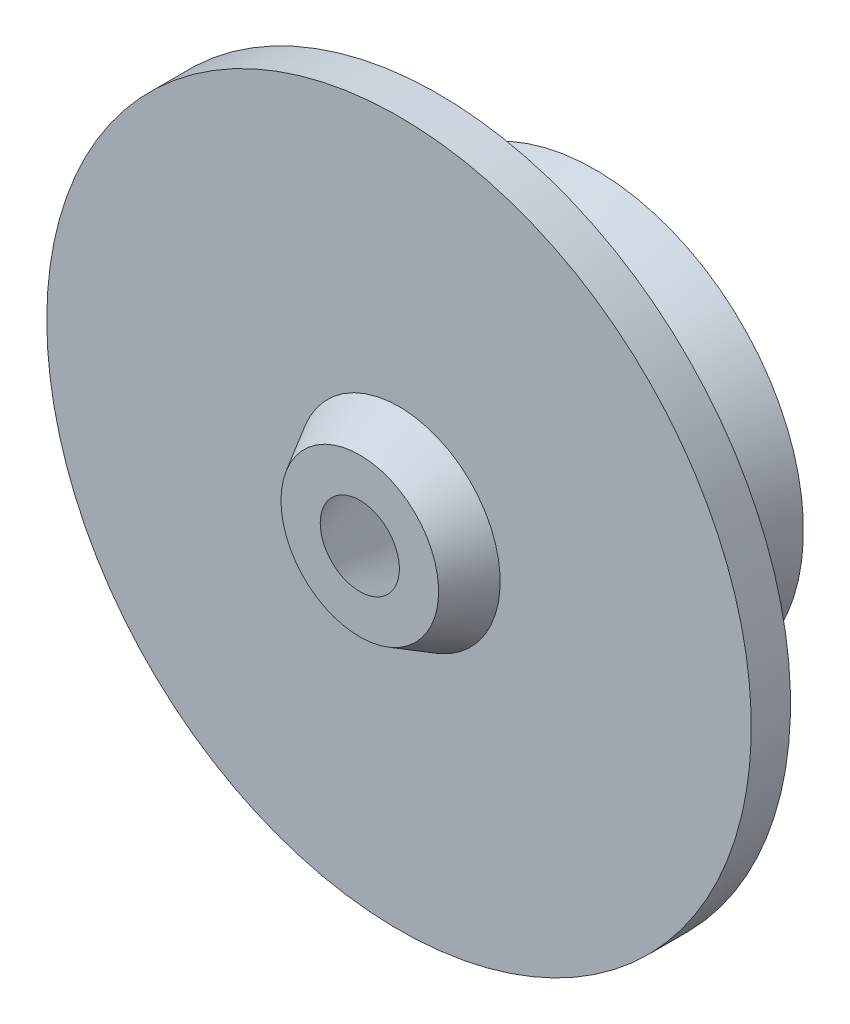
ISO-10303-21;
HEADER;
FILE_DESCRIPTION(('STEP AP214'),'2;1');
FILE_NAME('part.step','',(''),(''),'','','');
FILE_SCHEMA(('AUTOMOTIVE_DESIGN { 1 0 10303 214 1 1 1 1 }'));
ENDSEC;
DATA;
#1=APPLICATION_CONTEXT('core data for automotive mechanical design processes');
#2=APPLICATION_PROTOCOL_DEFINITION('international standard','automotive_design',2000,#1);
#3=PRODUCT_CONTEXT('',#1,'mechanical');
#4=PRODUCT('Part','Part','',(#3));
#5=PRODUCT_RELATED_PRODUCT_CATEGORY('part','',(#4));
#6=PRODUCT_DEFINITION_FORMATION('','',#4);
#7=PRODUCT_DEFINITION_CONTEXT('part definition',#1,'design');
#8=PRODUCT_DEFINITION('design','',#6,#7);
#9=PRODUCT_DEFINITION_SHAPE('','',#8);
#10=(LENGTH_UNIT() NAMED_UNIT(*) SI_UNIT(.MILLI.,.METRE.));
#11=(NAMED_UNIT(*) PLANE_ANGLE_UNIT() SI_UNIT($,.RADIAN.));
#12=(NAMED_UNIT(*) SI_UNIT($,.STERADIAN.) SOLID_ANGLE_UNIT());
#13=UNCERTAINTY_MEASURE_WITH_UNIT(LENGTH_MEASURE(1.E-05),#10,'distance_accuracy_value','');
#14=(GEOMETRIC_REPRESENTATION_CONTEXT(3) GLOBAL_UNCERTAINTY_ASSIGNED_CONTEXT((#13)) GLOBAL_UNIT_ASSIGNED_CONTEXT((#10,
#11,#12)) REPRESENTATION_CONTEXT('',''));
#15=CARTESIAN_POINT('',(0.,0.,0.));
#16=DIRECTION('',(0.,0.,1.));
#17=DIRECTION('',(1.,0.,0.));
#18=AXIS2_PLACEMENT_3D('',#15,#16,#17);
#19=CARTESIAN_POINT('',(12.752170304029,0.,5.60369170157772));
#20=DIRECTION('',(0.,0.,1.));
#21=DIRECTION('',(1.,0.,0.));
#22=AXIS2_PLACEMENT_3D('',#19,#20,#21);
#23=PLANE('',#22);
#24=CARTESIAN_POINT('',(0.,0.,5.60369170157772));
#25=DIRECTION('',(0.,0.,-1.));
#26=DIRECTION('',(-1.,0.,0.));
#27=AXIS2_PLACEMENT_3D('',#24,#25,#26);
#28=CIRCLE('',#27,6.40217030402902);
#29=CARTESIAN_POINT('',(-6.40217030402902,0.,5.60369170157772));
#30=VERTEX_POINT('',#29);
#31=EDGE_CURVE('E67',#30,#30,#28,.T.);
#32=ORIENTED_EDGE('',*,*,#31,.T.);
#33=EDGE_LOOP('',(#32));
#34=FACE_BOUND('',#33,.T.);
#35=CARTESIAN_POINT('',(0.,0.,5.60369170157772));
#36=DIRECTION('',(0.,0.,-1.));
#37=DIRECTION('',(-1.,0.,0.));
#38=AXIS2_PLACEMENT_3D('',#35,#36,#37);
#39=CIRCLE('',#38,12.752170304029);
#40=CARTESIAN_POINT('',(-12.752170304029,0.,5.60369170157772));
#41=VERTEX_POINT('',#40);
#42=EDGE_CURVE('E46',#41,#41,#39,.T.);
#43=ORIENTED_EDGE('',*,*,#42,.F.);
#44=EDGE_LOOP('',(#43));
#45=FACE_BOUND('',#44,.T.);
#46=ADVANCED_FACE('F35',(#34,#45),#23,.T.);
#47=CARTESIAN_POINT('',(0.,0.,-0.746308298422267));
#48=DIRECTION('',(0.,0.,-1.));
#49=DIRECTION('',(-1.,0.,0.));
#50=AXIS2_PLACEMENT_3D('',#47,#48,#49);
#51=CONICAL_SURFACE('',#50,16.369673718725,0.517831178154974);
#52=ORIENTED_EDGE('',*,*,#42,.T.);
#53=EDGE_LOOP('',(#52));
#54=FACE_BOUND('',#53,.T.);
#55=CARTESIAN_POINT('',(0.,0.,-0.746308298422267));
#56=DIRECTION('',(0.,0.,-1.));
#57=DIRECTION('',(-1.,0.,0.));
#58=AXIS2_PLACEMENT_3D('',#55,#56,#57);
#59=CIRCLE('',#58,16.369673718725);
#60=CARTESIAN_POINT('',(-16.369673718725,0.,-0.746308298422267));
#61=VERTEX_POINT('',#60);
#62=EDGE_CURVE('E50',#61,#61,#59,.T.);
#63=ORIENTED_EDGE('',*,*,#62,.F.);
#64=EDGE_LOOP('',(#63));
#65=FACE_BOUND('',#64,.T.);
#66=ADVANCED_FACE('F87',(#54,#65),#51,.T.);
#67=CARTESIAN_POINT('',(57.0034383546205,-3.98052882530105E-13,-0.74630829842227));
#68=DIRECTION('',(0.,0.,1.));
#69=DIRECTION('',(1.,0.,0.));
#70=AXIS2_PLACEMENT_3D('',#67,#68,#69);
#71=PLANE('',#70);
#72=ORIENTED_EDGE('',*,*,#62,.T.);
#73=EDGE_LOOP('',(#72));
#74=FACE_BOUND('',#73,.T.);
#75=CARTESIAN_POINT('',(0.,0.,-0.746308298422267));
#76=DIRECTION('',(0.,0.,-1.));
#77=DIRECTION('',(-1.,0.,0.));
#78=AXIS2_PLACEMENT_3D('',#75,#76,#77);
#79=CIRCLE('',#78,57.0034383546205);
#80=CARTESIAN_POINT('',(-57.0034383546205,0.,-0.746308298422268));
#81=VERTEX_POINT('',#80);
#82=EDGE_CURVE('E55',#81,#81,#79,.T.);
#83=ORIENTED_EDGE('',*,*,#82,.F.);
#84=EDGE_LOOP('',(#83));
#85=FACE_BOUND('',#84,.T.);
#86=ADVANCED_FACE('F91',(#74,#85),#71,.T.);
#87=CARTESIAN_POINT('',(0.,0.,-42.5975865089534));
#88=DIRECTION('',(0.,0.,-1.));
#89=DIRECTION('',(-1.,0.,0.));
#90=AXIS2_PLACEMENT_3D('',#87,#88,#89);
#91=CYLINDRICAL_SURFACE('',#90,57.0034383546205);
#92=ORIENTED_EDGE('',*,*,#82,.T.);
#93=EDGE_LOOP('',(#92));
#94=FACE_BOUND('',#93,.T.);
#95=CARTESIAN_POINT('',(0.,0.,-7.09630829842227));
#96=DIRECTION('',(0.,0.,-1.));
#97=DIRECTION('',(-1.,0.,0.));
#98=AXIS2_PLACEMENT_3D('',#95,#96,#97);
#99=CIRCLE('',#98,57.0034383546205);
#100=CARTESIAN_POINT('',(-57.0034383546205,0.,-7.09630829842227));
#101=VERTEX_POINT('',#100);
#102=EDGE_CURVE('E58',#101,#101,#99,.T.);
#103=ORIENTED_EDGE('',*,*,#102,.F.);
#104=EDGE_LOOP('',(#103));
#105=FACE_BOUND('',#104,.T.);
#106=ADVANCED_FACE('F97',(#94,#105),#91,.T.);
#107=CARTESIAN_POINT('',(21.8492775625974,-1.52572689754026E-13,-7.09630829842227));
#108=DIRECTION('',(0.,0.,-1.));
#109=DIRECTION('',(-1.,0.,0.));
#110=AXIS2_PLACEMENT_3D('',#107,#108,#109);
#111=PLANE('',#110);
#112=CARTESIAN_POINT('',(0.,0.,-7.09630829842227));
#113=DIRECTION('',(0.,0.,-1.));
#114=DIRECTION('',(-1.,0.,0.));
#115=AXIS2_PLACEMENT_3D('',#112,#113,#114);
#116=CIRCLE('',#115,41.7842843919894);
#117=CARTESIAN_POINT('',(-41.7842843919894,0.,-7.09630829842227));
#118=VERTEX_POINT('',#117);
#119=EDGE_CURVE('E10',#118,#118,#116,.F.);
#120=ORIENTED_EDGE('',*,*,#119,.T.);
#121=EDGE_LOOP('',(#120));
#122=FACE_BOUND('',#121,.T.);
#123=ORIENTED_EDGE('',*,*,#102,.T.);
#124=EDGE_LOOP('',(#123));
#125=FACE_BOUND('',#124,.T.);
#126=ADVANCED_FACE('F101',(#122,#125),#111,.T.);
#127=CARTESIAN_POINT('',(0.,0.,-32.4963082984223));
#128=DIRECTION('',(0.,0.,-1.));
#129=DIRECTION('',(-1.,0.,0.));
#130=AXIS2_PLACEMENT_3D('',#127,#128,#129);
#131=CONICAL_SURFACE('',#130,33.6934920797342,0.436332312998576);
#132=CARTESIAN_POINT('',(0.,0.,-25.1635602225291));
#133=DIRECTION('',(0.,0.,-1.));
#134=DIRECTION('',(-1.,0.,0.));
#135=AXIS2_PLACEMENT_3D('',#132,#133,#134);
#136=CIRCLE('',#135,30.2741754966239);
#137=CARTESIAN_POINT('',(-30.2741754966239,0.,-25.1635602225291));
#138=VERTEX_POINT('',#137);
#139=EDGE_CURVE('E42',#138,#138,#136,.T.);
#140=ORIENTED_EDGE('',*,*,#139,.T.);
#141=EDGE_LOOP('',(#140));
#142=FACE_BOUND('',#141,.T.);
#143=CARTESIAN_POINT('',(0.,0.,-32.4963082984223));
#144=DIRECTION('',(0.,0.,-1.));
#145=DIRECTION('',(-1.,0.,0.));
#146=AXIS2_PLACEMENT_3D('',#143,#144,#145);
#147=CIRCLE('',#146,33.6934920797342);
#148=CARTESIAN_POINT('',(-33.6934920797342,0.,-32.4963082984223));
#149=VERTEX_POINT('',#148);
#150=EDGE_CURVE('E61',#149,#149,#147,.T.);
#151=ORIENTED_EDGE('',*,*,#150,.F.);
#152=EDGE_LOOP('',(#151));
#153=FACE_BOUND('',#152,.T.);
#154=ADVANCED_FACE('F83',(#142,#153),#131,.T.);
#155=CARTESIAN_POINT('',(24.1684920797342,-1.6876767816874E-13,-32.4963082984223));
#156=DIRECTION('',(0.,0.,-1.));
#157=DIRECTION('',(-1.,0.,0.));
#158=AXIS2_PLACEMENT_3D('',#155,#156,#157);
#159=PLANE('',#158);
#160=ORIENTED_EDGE('',*,*,#150,.T.);
#161=EDGE_LOOP('',(#160));
#162=FACE_BOUND('',#161,.T.);
#163=CARTESIAN_POINT('',(0.,0.,-32.4963082984223));
#164=DIRECTION('',(0.,0.,-1.));
#165=DIRECTION('',(-1.,0.,0.));
#166=AXIS2_PLACEMENT_3D('',#163,#164,#165);
#167=CIRCLE('',#166,24.1684920797342);
#168=CARTESIAN_POINT('',(-24.1684920797342,0.,-32.4963082984223));
#169=VERTEX_POINT('',#168);
#170=EDGE_CURVE('E64',#169,#169,#167,.T.);
#171=ORIENTED_EDGE('',*,*,#170,.F.);
#172=EDGE_LOOP('',(#171));
#173=FACE_BOUND('',#172,.T.);
#174=ADVANCED_FACE('F75',(#162,#173),#159,.T.);
#175=CARTESIAN_POINT('',(0.,0.,5.60369170157772));
#176=DIRECTION('',(0.,0.,-1.));
#177=DIRECTION('',(-1.,0.,0.));
#178=AXIS2_PLACEMENT_3D('',#175,#176,#177);
#179=CONICAL_SURFACE('',#178,6.40217030402902,0.436332312998576);
#180=CARTESIAN_POINT('',(-24.1684920797342,0.,-32.4963082984223));
#181=CARTESIAN_POINT('',(-23.9834262279039,0.,-32.0994332984223));
#182=CARTESIAN_POINT('',(-23.7983603760737,0.,-31.7025582984223));
#183=CARTESIAN_POINT('',(-23.4282286724132,0.,-30.9088082984223));
#184=CARTESIAN_POINT('',(-23.2431628205829,0.,-30.5119332984223));
#185=CARTESIAN_POINT('',(-22.8730311169224,0.,-29.7181832984223));
#186=CARTESIAN_POINT('',(-22.6879652650921,0.,-29.3213082984223));
#187=CARTESIAN_POINT('',(-22.3178335614316,0.,-28.5275582984223));
#188=CARTESIAN_POINT('',(-22.1327677096013,0.,-28.1306832984223));
#189=CARTESIAN_POINT('',(-21.7626360059408,0.,-27.3369332984223));
#190=CARTESIAN_POINT('',(-21.5775701541105,0.,-26.9400582984223));
#191=CARTESIAN_POINT('',(-21.20743845045,0.,-26.1463082984223));
#192=CARTESIAN_POINT('',(-21.0223725986197,0.,-25.7494332984223));
#193=CARTESIAN_POINT('',(-20.6522408949592,0.,-24.9556832984223));
#194=CARTESIAN_POINT('',(-20.467175043129,0.,-24.5588082984223));
#195=CARTESIAN_POINT('',(-20.0970433394684,0.,-23.7650582984223));
#196=CARTESIAN_POINT('',(-19.9119774876382,0.,-23.3681832984223));
#197=CARTESIAN_POINT('',(-19.5418457839776,0.,-22.5744332984223));
#198=CARTESIAN_POINT('',(-19.3567799321474,0.,-22.1775582984223));
#199=CARTESIAN_POINT('',(-18.9866482284869,0.,-21.3838082984223));
#200=CARTESIAN_POINT('',(-18.8015823766566,0.,-20.9869332984223));
#201=CARTESIAN_POINT('',(-18.4314506729961,0.,-20.1931832984223));
#202=CARTESIAN_POINT('',(-18.2463848211658,0.,-19.7963082984223));
#203=CARTESIAN_POINT('',(-17.8762531175053,0.,-19.0025582984223));
#204=CARTESIAN_POINT('',(-17.691187265675,0.,-18.6056832984223));
#205=CARTESIAN_POINT('',(-17.3210555620145,0.,-17.8119332984223));
#206=CARTESIAN_POINT('',(-17.1359897101842,0.,-17.4150582984223));
#207=CARTESIAN_POINT('',(-16.7658580065237,0.,-16.6213082984223));
#208=CARTESIAN_POINT('',(-16.5807921546934,0.,-16.2244332984223));
#209=CARTESIAN_POINT('',(-16.2106604510329,0.,-15.4306832984223));
#210=CARTESIAN_POINT('',(-16.0255945992027,0.,-15.0338082984223));
#211=CARTESIAN_POINT('',(-15.6554628955421,0.,-14.2400582984223));
#212=CARTESIAN_POINT('',(-15.4703970437119,0.,-13.8431832984223));
#213=CARTESIAN_POINT('',(-15.1002653400513,0.,-13.0494332984223));
#214=CARTESIAN_POINT('',(-14.9151994882211,0.,-12.6525582984223));
#215=CARTESIAN_POINT('',(-14.5450677845606,0.,-11.8588082984223));
#216=CARTESIAN_POINT('',(-14.3600019327303,0.,-11.4619332984223));
#217=CARTESIAN_POINT('',(-13.9898702290698,0.,-10.6681832984223));
#218=CARTESIAN_POINT('',(-13.8048043772395,0.,-10.2713082984223));
#219=CARTESIAN_POINT('',(-13.434672673579,0.,-9.47755829842228));
#220=CARTESIAN_POINT('',(-13.2496068217487,0.,-9.08068329842228));
#221=CARTESIAN_POINT('',(-12.8794751180882,0.,-8.28693329842228));
#222=CARTESIAN_POINT('',(-12.6944092662579,0.,-7.89005829842228));
#223=CARTESIAN_POINT('',(-12.3242775625974,0.,-7.09630829842228));
#224=CARTESIAN_POINT('',(-12.1392117107672,0.,-6.69943329842228));
#225=CARTESIAN_POINT('',(-11.7690800071066,0.,-5.90568329842228));
#226=CARTESIAN_POINT('',(-11.5840141552764,0.,-5.50880829842228));
#227=CARTESIAN_POINT('',(-11.2138824516158,0.,-4.71505829842228));
#228=CARTESIAN_POINT('',(-11.0288165997856,0.,-4.31818329842228));
#229=CARTESIAN_POINT('',(-10.6586848961251,0.,-3.52443329842228));
#230=CARTESIAN_POINT('',(-10.4736190442948,0.,-3.12755829842228));
#231=CARTESIAN_POINT('',(-10.1034873406343,0.,-2.33380829842228));
#232=CARTESIAN_POINT('',(-9.91842148880401,0.,-1.93693329842228));
#233=CARTESIAN_POINT('',(-9.54828978514348,0.,-1.14318329842228));
#234=CARTESIAN_POINT('',(-9.36322393331322,0.,-0.746308298422282));
#235=CARTESIAN_POINT('',(-8.9930922296527,0.,0.0474417015777172));
#236=CARTESIAN_POINT('',(-8.80802637782243,0.,0.444316701577718));
#237=CARTESIAN_POINT('',(-8.43789467416191,0.,1.23806670157772));
#238=CARTESIAN_POINT('',(-8.25282882233165,0.,1.63494170157772));
#239=CARTESIAN_POINT('',(-7.88269711867112,0.,2.42869170157772));
#240=CARTESIAN_POINT('',(-7.69763126684086,0.,2.82556670157772));
#241=CARTESIAN_POINT('',(-7.32749956318034,0.,3.61931670157772));
#242=CARTESIAN_POINT('',(-7.14243371135007,0.,4.01619170157772));
#243=CARTESIAN_POINT('',(-6.77230200768955,0.,4.80994170157772));
#244=CARTESIAN_POINT('',(-6.58723615585929,0.,5.20681670157772));
#245=CARTESIAN_POINT('',(-6.40217030402902,0.,5.60369170157772));
#246=B_SPLINE_CURVE_WITH_KNOTS('',3,(#180,#181,#182,#183,#184,#185,#186,#187,#188,#189,#190,
#191,#192,#193,#194,#195,#196,#197,#198,#199,#200,#201,#202,#203,#204,#205,#206,#207,#208,#209,
#210,#211,#212,#213,#214,#215,#216,#217,#218,#219,#220,#221,#222,#223,#224,#225,#226,#227,#228,
#229,#230,#231,#232,#233,#234,#235,#236,#237,#238,#239,#240,#241,#242,#243,#244,#245),
.UNSPECIFIED.,.F.,.F.,(4,2,2,2,2,2,2,2,2,2,2,2,2,2,2,2,2,2,2,2,2,2,2,2,2,2,2,2,2,2,2,2,4),(0.,
1.31370933476471,2.62741866952943,3.94112800429414,5.25483733905886,6.56854667382357,
7.88225600858828,9.195965343353,10.5096746781177,11.8233840128824,13.1370933476471,
14.4508026824118,15.7645120171766,17.0782213519413,18.391930686706,19.7056400214707,
21.0193493562354,22.3330586910001,23.6467680257648,24.9604773605296,26.2741866952943,
27.587896030059,28.9016053648237,30.2153146995884,31.5290240343531,32.8427333691178,
34.1564427038826,35.4701520386473,36.783861373412,38.0975707081767,39.4112800429414,
40.7249893777061,42.0386987124708),.UNSPECIFIED.);
#247=EDGE_CURVE('BSEAM73',#169,#30,#246,.T.);
#248=ORIENTED_EDGE('',*,*,#170,.T.);
#249=ORIENTED_EDGE('',*,*,#31,.F.);
#250=ORIENTED_EDGE('',*,*,#247,.T.);
#251=ORIENTED_EDGE('',*,*,#247,.F.);
#252=EDGE_LOOP('',(#248,#250,#249,#251));
#253=FACE_BOUND('',#252,.T.);
#254=ADVANCED_FACE('F73',(#253),#179,.F.);
#255=CARTESIAN_POINT('',(0.,0.,-19.7963082984223));
#256=DIRECTION('',(0.,0.,-1.));
#257=DIRECTION('',(-1.,0.,0.));
#258=AXIS2_PLACEMENT_3D('',#255,#256,#257);
#259=TOROIDAL_SURFACE('',#258,41.7842843919894,12.7);
#260=ORIENTED_EDGE('',*,*,#119,.F.);
#261=EDGE_LOOP('',(#260));
#262=FACE_BOUND('',#261,.T.);
#263=ORIENTED_EDGE('',*,*,#139,.F.);
#264=EDGE_LOOP('',(#263));
#265=FACE_BOUND('',#264,.T.);
#266=ADVANCED_FACE('F37',(#262,#265),#259,.F.);
#267=CLOSED_SHELL('',(#46,#66,#86,#106,#126,#154,#174,#254,#266));
#268=MANIFOLD_SOLID_BREP('B2',#267);
#269=ADVANCED_BREP_SHAPE_REPRESENTATION('',(#18,#268),#14);
#270=SHAPE_DEFINITION_REPRESENTATION(#9,#269);
ENDSEC;
END-ISO-10303-21;
